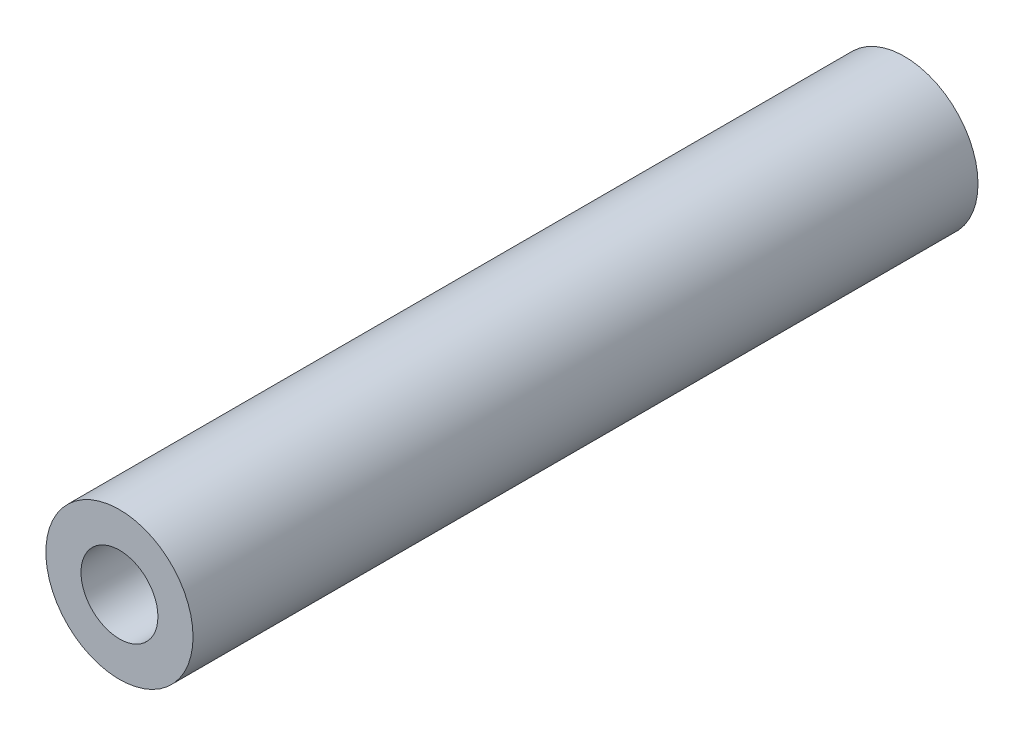
ISO-10303-21;
HEADER;
FILE_DESCRIPTION(('STEP AP214'),'2;1');
FILE_NAME('part.step','',(''),(''),'','','');
FILE_SCHEMA(('AUTOMOTIVE_DESIGN { 1 0 10303 214 1 1 1 1 }'));
ENDSEC;
DATA;
#1=APPLICATION_CONTEXT('core data for automotive mechanical design processes');
#2=APPLICATION_PROTOCOL_DEFINITION('international standard','automotive_design',2000,#1);
#3=PRODUCT_CONTEXT('',#1,'mechanical');
#4=PRODUCT('Part','Part','',(#3));
#5=PRODUCT_RELATED_PRODUCT_CATEGORY('part','',(#4));
#6=PRODUCT_DEFINITION_FORMATION('','',#4);
#7=PRODUCT_DEFINITION_CONTEXT('part definition',#1,'design');
#8=PRODUCT_DEFINITION('design','',#6,#7);
#9=PRODUCT_DEFINITION_SHAPE('','',#8);
#10=(LENGTH_UNIT() NAMED_UNIT(*) SI_UNIT(.MILLI.,.METRE.));
#11=(NAMED_UNIT(*) PLANE_ANGLE_UNIT() SI_UNIT($,.RADIAN.));
#12=(NAMED_UNIT(*) SI_UNIT($,.STERADIAN.) SOLID_ANGLE_UNIT());
#13=UNCERTAINTY_MEASURE_WITH_UNIT(LENGTH_MEASURE(1.E-05),#10,'distance_accuracy_value','');
#14=(GEOMETRIC_REPRESENTATION_CONTEXT(3) GLOBAL_UNCERTAINTY_ASSIGNED_CONTEXT((#13)) GLOBAL_UNIT_ASSIGNED_CONTEXT((#10,
#11,#12)) REPRESENTATION_CONTEXT('',''));
#15=CARTESIAN_POINT('',(0.,0.,0.));
#16=DIRECTION('',(0.,0.,1.));
#17=DIRECTION('',(1.,0.,0.));
#18=AXIS2_PLACEMENT_3D('',#15,#16,#17);
#19=CARTESIAN_POINT('',(0.,0.,50.8));
#20=DIRECTION('',(0.,0.,1.));
#21=DIRECTION('',(1.,0.,0.));
#22=AXIS2_PLACEMENT_3D('',#19,#20,#21);
#23=PLANE('',#22);
#24=CARTESIAN_POINT('',(0.,0.,50.8));
#25=DIRECTION('',(0.,0.,1.));
#26=DIRECTION('',(1.,0.,0.));
#27=AXIS2_PLACEMENT_3D('',#24,#25,#26);
#28=CIRCLE('',#27,4.7625);
#29=CARTESIAN_POINT('',(4.7625,0.,50.8));
#30=VERTEX_POINT('',#29);
#31=EDGE_CURVE('E10',#30,#30,#28,.T.);
#32=ORIENTED_EDGE('',*,*,#31,.T.);
#33=EDGE_LOOP('',(#32));
#34=FACE_BOUND('',#33,.T.);
#35=CARTESIAN_POINT('',(0.,0.,50.8));
#36=DIRECTION('',(0.,0.,1.));
#37=DIRECTION('',(1.,0.,0.));
#38=AXIS2_PLACEMENT_3D('',#35,#36,#37);
#39=CIRCLE('',#38,2.4892);
#40=CARTESIAN_POINT('',(2.4892,0.,50.8));
#41=VERTEX_POINT('',#40);
#42=EDGE_CURVE('E48',#41,#41,#39,.T.);
#43=ORIENTED_EDGE('',*,*,#42,.F.);
#44=EDGE_LOOP('',(#43));
#45=FACE_BOUND('',#44,.T.);
#46=ADVANCED_FACE('F37',(#34,#45),#23,.T.);
#47=CARTESIAN_POINT('',(0.,0.,0.));
#48=DIRECTION('',(0.,0.,1.));
#49=DIRECTION('',(1.,0.,0.));
#50=AXIS2_PLACEMENT_3D('',#47,#48,#49);
#51=PLANE('',#50);
#52=CARTESIAN_POINT('',(0.,0.,0.));
#53=DIRECTION('',(0.,0.,1.));
#54=DIRECTION('',(1.,0.,0.));
#55=AXIS2_PLACEMENT_3D('',#52,#53,#54);
#56=CIRCLE('',#55,4.7625);
#57=CARTESIAN_POINT('',(4.7625,0.,0.));
#58=VERTEX_POINT('',#57);
#59=EDGE_CURVE('E41',#58,#58,#56,.T.);
#60=ORIENTED_EDGE('',*,*,#59,.F.);
#61=EDGE_LOOP('',(#60));
#62=FACE_BOUND('',#61,.T.);
#63=CARTESIAN_POINT('',(0.,0.,0.));
#64=DIRECTION('',(0.,0.,1.));
#65=DIRECTION('',(1.,0.,0.));
#66=AXIS2_PLACEMENT_3D('',#63,#64,#65);
#67=CIRCLE('',#66,2.4892);
#68=CARTESIAN_POINT('',(2.4892,0.,0.));
#69=VERTEX_POINT('',#68);
#70=EDGE_CURVE('E50',#69,#69,#67,.T.);
#71=ORIENTED_EDGE('',*,*,#70,.T.);
#72=EDGE_LOOP('',(#71));
#73=FACE_BOUND('',#72,.T.);
#74=ADVANCED_FACE('F60',(#62,#73),#51,.F.);
#75=CARTESIAN_POINT('',(0.,0.,50.8));
#76=DIRECTION('',(0.,0.,-1.));
#77=DIRECTION('',(-1.,0.,0.));
#78=AXIS2_PLACEMENT_3D('',#75,#76,#77);
#79=CYLINDRICAL_SURFACE('',#78,4.7625);
#80=ORIENTED_EDGE('',*,*,#31,.F.);
#81=EDGE_LOOP('',(#80));
#82=FACE_BOUND('',#81,.T.);
#83=ORIENTED_EDGE('',*,*,#59,.T.);
#84=EDGE_LOOP('',(#83));
#85=FACE_BOUND('',#84,.T.);
#86=ADVANCED_FACE('F39',(#82,#85),#79,.T.);
#87=CARTESIAN_POINT('',(0.,0.,50.8));
#88=DIRECTION('',(0.,0.,-1.));
#89=DIRECTION('',(-1.,0.,0.));
#90=AXIS2_PLACEMENT_3D('',#87,#88,#89);
#91=CYLINDRICAL_SURFACE('',#90,2.4892);
#92=ORIENTED_EDGE('',*,*,#42,.T.);
#93=EDGE_LOOP('',(#92));
#94=FACE_BOUND('',#93,.T.);
#95=ORIENTED_EDGE('',*,*,#70,.F.);
#96=EDGE_LOOP('',(#95));
#97=FACE_BOUND('',#96,.T.);
#98=ADVANCED_FACE('F56',(#94,#97),#91,.F.);
#99=CLOSED_SHELL('',(#46,#74,#86,#98));
#100=MANIFOLD_SOLID_BREP('B2',#99);
#101=ADVANCED_BREP_SHAPE_REPRESENTATION('',(#18,#100),#14);
#102=SHAPE_DEFINITION_REPRESENTATION(#9,#101);
ENDSEC;
END-ISO-10303-21;
